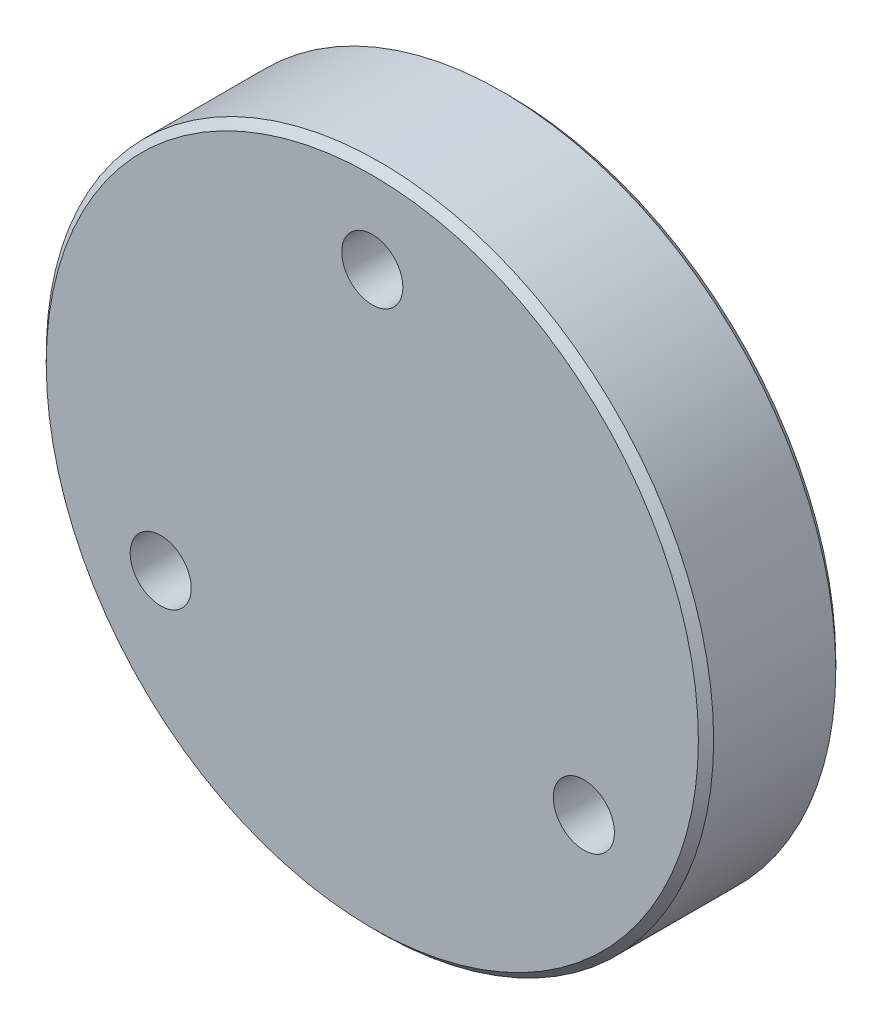
ISO-10303-21;
HEADER;
FILE_DESCRIPTION(('STEP AP214'),'2;1');
FILE_NAME('part.step','',(''),(''),'','','');
FILE_SCHEMA(('AUTOMOTIVE_DESIGN { 1 0 10303 214 1 1 1 1 }'));
ENDSEC;
DATA;
#1=APPLICATION_CONTEXT('core data for automotive mechanical design processes');
#2=APPLICATION_PROTOCOL_DEFINITION('international standard','automotive_design',2000,#1);
#3=PRODUCT_CONTEXT('',#1,'mechanical');
#4=PRODUCT('Part','Part','',(#3));
#5=PRODUCT_RELATED_PRODUCT_CATEGORY('part','',(#4));
#6=PRODUCT_DEFINITION_FORMATION('','',#4);
#7=PRODUCT_DEFINITION_CONTEXT('part definition',#1,'design');
#8=PRODUCT_DEFINITION('design','',#6,#7);
#9=PRODUCT_DEFINITION_SHAPE('','',#8);
#10=(LENGTH_UNIT() NAMED_UNIT(*) SI_UNIT(.MILLI.,.METRE.));
#11=(NAMED_UNIT(*) PLANE_ANGLE_UNIT() SI_UNIT($,.RADIAN.));
#12=(NAMED_UNIT(*) SI_UNIT($,.STERADIAN.) SOLID_ANGLE_UNIT());
#13=UNCERTAINTY_MEASURE_WITH_UNIT(LENGTH_MEASURE(1.E-05),#10,'distance_accuracy_value','');
#14=(GEOMETRIC_REPRESENTATION_CONTEXT(3) GLOBAL_UNCERTAINTY_ASSIGNED_CONTEXT((#13)) GLOBAL_UNIT_ASSIGNED_CONTEXT((#10,
#11,#12)) REPRESENTATION_CONTEXT('',''));
#15=CARTESIAN_POINT('',(0.,0.,0.));
#16=DIRECTION('',(0.,0.,1.));
#17=DIRECTION('',(1.,0.,0.));
#18=AXIS2_PLACEMENT_3D('',#15,#16,#17);
#19=CARTESIAN_POINT('',(0.,0.,14.2875));
#20=DIRECTION('',(0.,0.,-1.));
#21=DIRECTION('',(-1.,0.,0.));
#22=AXIS2_PLACEMENT_3D('',#19,#20,#21);
#23=CYLINDRICAL_SURFACE('',#22,34.6944134078212);
#24=CARTESIAN_POINT('',(0.,-34.6944134078212,3.57187499999998));
#25=CARTESIAN_POINT('',(-0.200065709950713,-34.6944110443672,3.57188364779328));
#26=CARTESIAN_POINT('',(-0.400262921462358,-34.69266450977,3.5887405414694));
#27=CARTESIAN_POINT('',(-0.795104904097458,-34.6858651867832,3.65573028330991));
#28=CARTESIAN_POINT('',(-0.989743348085185,-34.6808087761864,3.7058995882235));
#29=CARTESIAN_POINT('',(-1.36769308672924,-34.6679603571713,3.83803625385658));
#30=CARTESIAN_POINT('',(-1.55101122725323,-34.660170021508,3.91998417400904));
#31=CARTESIAN_POINT('',(-1.90125158680547,-34.6427243502095,4.11331359680572));
#32=CARTESIAN_POINT('',(-2.06817700934844,-34.6330693800653,4.22468933281337));
#33=CARTESIAN_POINT('',(-2.38156773354439,-34.6129345417707,4.47416716212354));
#34=CARTESIAN_POINT('',(-2.52796191455414,-34.6024519937122,4.6123583883865));
#35=CARTESIAN_POINT('',(-2.79552314349917,-34.5818655481583,4.91135415840236));
#36=CARTESIAN_POINT('',(-2.91668901255712,-34.5717616683756,5.07215975829956));
#37=CARTESIAN_POINT('',(-3.13060759837356,-34.5530492956127,5.41226675353249));
#38=CARTESIAN_POINT('',(-3.22329568997945,-34.5444442227752,5.59160900074904));
#39=CARTESIAN_POINT('',(-3.37721499252556,-34.5297372463541,5.96341541971245));
#40=CARTESIAN_POINT('',(-3.43844702447323,-34.5236352774399,6.1558792488357));
#41=CARTESIAN_POINT('',(-3.52750458098557,-34.5146497892999,6.54773855611576));
#42=CARTESIAN_POINT('',(-3.55544832782174,-34.5117548828768,6.74710690047951));
#43=CARTESIAN_POINT('',(-3.57750158119704,-34.5094759995546,7.14772318974449));
#44=CARTESIAN_POINT('',(-3.5716120270518,-34.5100919251841,7.34897108230885));
#45=CARTESIAN_POINT('',(-3.52626325983416,-34.5147547126571,7.74681788414604));
#46=CARTESIAN_POINT('',(-3.48693325039603,-34.5187883692316,7.94343169730891));
#47=CARTESIAN_POINT('',(-3.37602110389757,-34.529811503914,8.32725301255348));
#48=CARTESIAN_POINT('',(-3.30443850768617,-34.5368010241018,8.5144603806819));
#49=CARTESIAN_POINT('',(-3.13091093986535,-34.5529635161083,8.87456209980281));
#50=CARTESIAN_POINT('',(-3.02890877091563,-34.5621405945684,9.04742869644998));
#51=CARTESIAN_POINT('',(-2.79747860493039,-34.5816407384582,9.37363806958224));
#52=CARTESIAN_POINT('',(-2.66804975684523,-34.5919638394441,9.5269802399881));
#53=CARTESIAN_POINT('',(-2.38471920378483,-34.6126517051266,9.81053864629053));
#54=CARTESIAN_POINT('',(-2.23070593823176,-34.6230164390335,9.94064343952025));
#55=CARTESIAN_POINT('',(-1.90296545437887,-34.6425742080327,10.1731697069228));
#56=CARTESIAN_POINT('',(-1.72923821191659,-34.651767241689,10.275591147165));
#57=CARTESIAN_POINT('',(-1.3669231098645,-34.6679490871249,10.4498393536093));
#58=CARTESIAN_POINT('',(-1.17833244331231,-34.674937481305,10.5216603244184));
#59=CARTESIAN_POINT('',(-0.791680920420327,-34.6859184404969,10.6325864605885));
#60=CARTESIAN_POINT('',(-0.593620364515187,-34.6899111004822,10.6716926631068));
#61=CARTESIAN_POINT('',(-0.194616210825272,-34.694438509858,10.715937476107));
#62=CARTESIAN_POINT('',(0.00631016720905355,-34.6949889112239,10.7212298407363));
#63=CARTESIAN_POINT('',(0.406189528983666,-34.6926117884111,10.6981007842273));
#64=CARTESIAN_POINT('',(0.605142540969468,-34.6896843140853,10.6696798463441));
#65=CARTESIAN_POINT('',(0.994982789669328,-34.6806903847393,10.5800585274081));
#66=CARTESIAN_POINT('',(1.18588678192927,-34.6746308381503,10.5189302786798));
#67=CARTESIAN_POINT('',(1.55473111639982,-34.6600524047736,10.3657037655833));
#68=CARTESIAN_POINT('',(1.73267115140902,-34.6515334597303,10.2736047676045));
#69=CARTESIAN_POINT('',(2.07123077672363,-34.6329497787846,10.0606707935239));
#70=CARTESIAN_POINT('',(2.23178663676371,-34.6228796626689,9.93973496507906));
#71=CARTESIAN_POINT('',(2.53037486089912,-34.6023404868262,9.67270465268041));
#72=CARTESIAN_POINT('',(2.66840662496828,-34.5918714164805,9.52660949871274));
#73=CARTESIAN_POINT('',(2.91856354701982,-34.5716670393567,9.21273606581639));
#74=CARTESIAN_POINT('',(3.03058768590625,-34.5619346895812,9.04487705746078));
#75=CARTESIAN_POINT('',(3.22485458791267,-34.5443510509701,8.69263830793547));
#76=CARTESIAN_POINT('',(3.30709777929125,-34.5364997350852,8.50825880438278));
#77=CARTESIAN_POINT('',(3.43929967852738,-34.5235857564001,8.12855717002103));
#78=CARTESIAN_POINT('',(3.48931815523875,-34.5185179335016,7.9332560319209));
#79=CARTESIAN_POINT('',(3.55584456712241,-34.5117288366072,7.53697228773681));
#80=CARTESIAN_POINT('',(3.57235352623975,-34.5100074603546,7.33598985544555));
#81=CARTESIAN_POINT('',(3.57137757781351,-34.5101083957438,6.93505282051145));
#82=CARTESIAN_POINT('',(3.55405135694837,-34.5119141651142,6.73509780853862));
#83=CARTESIAN_POINT('',(3.48622995093089,-34.5188306231274,6.34095546608301));
#84=CARTESIAN_POINT('',(3.43573473149658,-34.523941315186,6.14676814156166));
#85=CARTESIAN_POINT('',(3.30305313206579,-34.5368871260599,5.76967677835391));
#86=CARTESIAN_POINT('',(3.22087173699057,-34.5447218163124,5.58677097008849));
#87=CARTESIAN_POINT('',(3.02716685044931,-34.562233699924,5.23732349888326));
#88=CARTESIAN_POINT('',(2.91564346579349,-34.5719108865759,5.07078177637822));
#89=CARTESIAN_POINT('',(2.66582497631859,-34.5920717691508,4.75797681917923));
#90=CARTESIAN_POINT('',(2.52741157857181,-34.602558900595,4.61180827652558));
#91=CARTESIAN_POINT('',(2.22797831138865,-34.6231267502047,4.34470391101239));
#92=CARTESIAN_POINT('',(2.06695304485436,-34.6332073706009,4.22377412943182));
#93=CARTESIAN_POINT('',(1.72639689697515,-34.6518543899312,4.01032512028235));
#94=CARTESIAN_POINT('',(1.54681809954751,-34.6604167047653,3.91788204143709));
#95=CARTESIAN_POINT('',(1.17471163443001,-34.6750184138567,3.76458653411932));
#96=CARTESIAN_POINT('',(0.982198786656986,-34.68106064028,3.70369862403688));
#97=CARTESIAN_POINT('',(0.657171380798965,-34.6884296835932,3.63036002808357));
#98=CARTESIAN_POINT('',(0.526731805438114,-34.6906630671697,3.60845827202057));
#99=CARTESIAN_POINT('',(0.26421393592816,-34.6936557064992,3.57921293450017));
#100=CARTESIAN_POINT('',(0.132135649050478,-34.694414968791,3.5718692884676));
#101=CARTESIAN_POINT('',(0.,-34.6944134078212,3.57187499999998));
#102=B_SPLINE_CURVE_WITH_KNOTS('',3,(#24,#25,#26,#27,#28,#29,#30,#31,#32,#33,#34,#35,#36,#37,
#38,#39,#40,#41,#42,#43,#44,#45,#46,#47,#48,#49,#50,#51,#52,#53,#54,#55,#56,#57,#58,#59,#60,#61,
#62,#63,#64,#65,#66,#67,#68,#69,#70,#71,#72,#73,#74,#75,#76,#77,#78,#79,#80,#81,#82,#83,#84,#85,
#86,#87,#88,#89,#90,#91,#92,#93,#94,#95,#96,#97,#98,#99,#100,#101),.UNSPECIFIED.,.T.,.F.,(4,2,2,
2,2,2,2,2,2,2,2,2,2,2,2,2,2,2,2,2,2,2,2,2,2,2,2,2,2,2,2,2,2,2,2,2,2,2,4),(0.,0.599714605358392,
1.20008661613602,1.8000919272735,2.39997974923749,3.00189681511426,3.6038420012715,
4.20714327185287,4.81042879538862,5.41156532083811,6.01268515698471,6.61149295016588,
7.21030926830437,7.81025870547282,8.41022676179453,9.01299911995594,9.61577221691371,
10.218659421792,10.8215275125951,11.4216523527038,12.0217685905729,12.6205667614403,
13.2193791171627,13.820317263107,14.4212714150115,15.0245221400423,15.6277641898099,
16.2298841293251,16.8319856696791,17.4312701404845,18.0305552306839,18.6297460788115,
19.2289347458051,19.8308215880257,20.4328523361422,21.036478704595,21.6394248561138,
22.0355148714687,22.4316031298894),.UNSPECIFIED.);
#103=CARTESIAN_POINT('',(0.,-34.6944134078212,3.57187499999998));
#104=VERTEX_POINT('',#103);
#105=EDGE_CURVE('E70',#104,#104,#102,.T.);
#106=ORIENTED_EDGE('',*,*,#105,.T.);
#107=EDGE_LOOP('',(#106));
#108=FACE_BOUND('',#107,.T.);
#109=CARTESIAN_POINT('',(0.,0.,13.49375));
#110=DIRECTION('',(0.,0.,1.));
#111=DIRECTION('',(1.,0.,0.));
#112=AXIS2_PLACEMENT_3D('',#109,#110,#111);
#113=CIRCLE('',#112,34.6944134078212);
#114=CARTESIAN_POINT('',(34.6944134078212,0.,13.49375));
#115=VERTEX_POINT('',#114);
#116=EDGE_CURVE('E147',#115,#115,#113,.F.);
#117=ORIENTED_EDGE('',*,*,#116,.T.);
#118=EDGE_LOOP('',(#117));
#119=FACE_BOUND('',#118,.T.);
#120=CARTESIAN_POINT('',(0.,0.,0.79375000000001));
#121=DIRECTION('',(0.,0.,1.));
#122=DIRECTION('',(1.,0.,0.));
#123=AXIS2_PLACEMENT_3D('',#120,#121,#122);
#124=CIRCLE('',#123,34.6944134078212);
#125=CARTESIAN_POINT('',(34.6944134078212,0.,0.79375000000001));
#126=VERTEX_POINT('',#125);
#127=EDGE_CURVE('E150',#126,#126,#124,.T.);
#128=ORIENTED_EDGE('',*,*,#127,.T.);
#129=EDGE_LOOP('',(#128));
#130=FACE_BOUND('',#129,.T.);
#131=ADVANCED_FACE('F43',(#108,#119,#130),#23,.T.);
#132=CARTESIAN_POINT('',(0.,0.,14.2875));
#133=DIRECTION('',(0.,0.,1.));
#134=DIRECTION('',(1.,0.,0.));
#135=AXIS2_PLACEMENT_3D('',#132,#133,#134);
#136=PLANE('',#135);
#137=CARTESIAN_POINT('',(0.,0.,14.2875));
#138=DIRECTION('',(0.,0.,1.));
#139=DIRECTION('',(1.,0.,0.));
#140=AXIS2_PLACEMENT_3D('',#137,#138,#139);
#141=CIRCLE('',#140,33.9006634078212);
#142=CARTESIAN_POINT('',(33.9006634078212,0.,14.2875));
#143=VERTEX_POINT('',#142);
#144=EDGE_CURVE('E152',#143,#143,#141,.T.);
#145=ORIENTED_EDGE('',*,*,#144,.T.);
#146=EDGE_LOOP('',(#145));
#147=FACE_BOUND('',#146,.T.);
#148=CARTESIAN_POINT('',(0.,25.4,14.2875));
#149=DIRECTION('',(0.,0.,-1.));
#150=DIRECTION('',(-1.,0.,0.));
#151=AXIS2_PLACEMENT_3D('',#148,#149,#150);
#152=CIRCLE('',#151,3.175);
#153=CARTESIAN_POINT('',(-3.175,25.4,14.2875));
#154=VERTEX_POINT('',#153);
#155=EDGE_CURVE('E175',#154,#154,#152,.T.);
#156=ORIENTED_EDGE('',*,*,#155,.T.);
#157=EDGE_LOOP('',(#156));
#158=FACE_BOUND('',#157,.T.);
#159=CARTESIAN_POINT('',(-21.9970452561247,-12.7000000000001,14.2875));
#160=DIRECTION('',(0.,0.,-1.));
#161=DIRECTION('',(-1.,0.,0.));
#162=AXIS2_PLACEMENT_3D('',#159,#160,#161);
#163=CIRCLE('',#162,3.175);
#164=CARTESIAN_POINT('',(-25.1720452561247,-12.7000000000001,14.2875));
#165=VERTEX_POINT('',#164);
#166=EDGE_CURVE('E166',#165,#165,#163,.T.);
#167=ORIENTED_EDGE('',*,*,#166,.T.);
#168=EDGE_LOOP('',(#167));
#169=FACE_BOUND('',#168,.T.);
#170=CARTESIAN_POINT('',(21.9970452561249,-12.6999999999998,14.2875));
#171=DIRECTION('',(0.,0.,-1.));
#172=DIRECTION('',(-1.,0.,0.));
#173=AXIS2_PLACEMENT_3D('',#170,#171,#172);
#174=CIRCLE('',#173,3.175);
#175=CARTESIAN_POINT('',(18.8220452561249,-12.6999999999998,14.2875));
#176=VERTEX_POINT('',#175);
#177=EDGE_CURVE('E155',#176,#176,#174,.T.);
#178=ORIENTED_EDGE('',*,*,#177,.T.);
#179=EDGE_LOOP('',(#178));
#180=FACE_BOUND('',#179,.T.);
#181=ADVANCED_FACE('F128',(#147,#158,#169,#180),#136,.T.);
#182=CARTESIAN_POINT('',(0.,0.,0.));
#183=DIRECTION('',(0.,0.,1.));
#184=DIRECTION('',(1.,0.,0.));
#185=AXIS2_PLACEMENT_3D('',#182,#183,#184);
#186=PLANE('',#185);
#187=CARTESIAN_POINT('',(-21.9970452561247,-12.7000000000001,0.));
#188=DIRECTION('',(0.,0.,1.));
#189=DIRECTION('',(1.,0.,0.));
#190=AXIS2_PLACEMENT_3D('',#187,#188,#189);
#191=CIRCLE('',#190,6.746875);
#192=CARTESIAN_POINT('',(-15.2501702561247,-12.7000000000001,0.));
#193=VERTEX_POINT('',#192);
#194=EDGE_CURVE('E55',#193,#193,#191,.T.);
#195=ORIENTED_EDGE('',*,*,#194,.T.);
#196=EDGE_LOOP('',(#195));
#197=FACE_BOUND('',#196,.T.);
#198=CARTESIAN_POINT('',(21.9970452561249,-12.6999999999998,0.));
#199=DIRECTION('',(0.,0.,1.));
#200=DIRECTION('',(1.,0.,0.));
#201=AXIS2_PLACEMENT_3D('',#198,#199,#200);
#202=CIRCLE('',#201,6.746875);
#203=CARTESIAN_POINT('',(28.7439202561249,-12.6999999999998,0.));
#204=VERTEX_POINT('',#203);
#205=EDGE_CURVE('E59',#204,#204,#202,.T.);
#206=ORIENTED_EDGE('',*,*,#205,.T.);
#207=EDGE_LOOP('',(#206));
#208=FACE_BOUND('',#207,.T.);
#209=CARTESIAN_POINT('',(0.,25.4,0.));
#210=DIRECTION('',(0.,0.,1.));
#211=DIRECTION('',(1.,0.,0.));
#212=AXIS2_PLACEMENT_3D('',#209,#210,#211);
#213=CIRCLE('',#212,6.746875);
#214=CARTESIAN_POINT('',(6.746875,25.4,0.));
#215=VERTEX_POINT('',#214);
#216=EDGE_CURVE('E64',#215,#215,#213,.T.);
#217=ORIENTED_EDGE('',*,*,#216,.T.);
#218=EDGE_LOOP('',(#217));
#219=FACE_BOUND('',#218,.T.);
#220=CARTESIAN_POINT('',(0.,0.,0.));
#221=DIRECTION('',(0.,0.,1.));
#222=DIRECTION('',(1.,0.,0.));
#223=AXIS2_PLACEMENT_3D('',#220,#221,#222);
#224=CIRCLE('',#223,33.9006634078212);
#225=CARTESIAN_POINT('',(33.9006634078212,0.,0.));
#226=VERTEX_POINT('',#225);
#227=EDGE_CURVE('E78',#226,#226,#224,.F.);
#228=ORIENTED_EDGE('',*,*,#227,.T.);
#229=EDGE_LOOP('',(#228));
#230=FACE_BOUND('',#229,.T.);
#231=ADVANCED_FACE('F126',(#197,#208,#219,#230),#186,.F.);
#232=CARTESIAN_POINT('',(21.9970452561249,-12.6999999999998,0.));
#233=DIRECTION('',(0.,0.,-1.));
#234=DIRECTION('',(-1.,0.,0.));
#235=AXIS2_PLACEMENT_3D('',#232,#233,#234);
#236=CYLINDRICAL_SURFACE('',#235,3.175);
#237=ORIENTED_EDGE('',*,*,#177,.F.);
#238=EDGE_LOOP('',(#237));
#239=FACE_BOUND('',#238,.T.);
#240=CARTESIAN_POINT('',(21.9970452561249,-12.6999999999998,5.08));
#241=DIRECTION('',(0.,0.,-1.));
#242=DIRECTION('',(-1.,0.,0.));
#243=AXIS2_PLACEMENT_3D('',#240,#241,#242);
#244=CIRCLE('',#243,3.175);
#245=CARTESIAN_POINT('',(18.8220452561249,-12.6999999999998,5.08));
#246=VERTEX_POINT('',#245);
#247=EDGE_CURVE('E160',#246,#246,#244,.T.);
#248=ORIENTED_EDGE('',*,*,#247,.T.);
#249=EDGE_LOOP('',(#248));
#250=FACE_BOUND('',#249,.T.);
#251=ADVANCED_FACE('F122',(#239,#250),#236,.F.);
#252=CARTESIAN_POINT('',(25.1720452561249,-12.6999999999998,5.08));
#253=DIRECTION('',(0.,0.,1.));
#254=DIRECTION('',(1.,0.,0.));
#255=AXIS2_PLACEMENT_3D('',#252,#253,#254);
#256=PLANE('',#255);
#257=ORIENTED_EDGE('',*,*,#247,.F.);
#258=EDGE_LOOP('',(#257));
#259=FACE_BOUND('',#258,.T.);
#260=CARTESIAN_POINT('',(21.9970452561249,-12.6999999999998,5.08));
#261=DIRECTION('',(0.,0.,-1.));
#262=DIRECTION('',(-1.,0.,0.));
#263=AXIS2_PLACEMENT_3D('',#260,#261,#262);
#264=CIRCLE('',#263,6.35);
#265=CARTESIAN_POINT('',(15.6470452561249,-12.6999999999998,5.08));
#266=VERTEX_POINT('',#265);
#267=EDGE_CURVE('E163',#266,#266,#264,.T.);
#268=ORIENTED_EDGE('',*,*,#267,.T.);
#269=EDGE_LOOP('',(#268));
#270=FACE_BOUND('',#269,.T.);
#271=ADVANCED_FACE('F119',(#259,#270),#256,.F.);
#272=CARTESIAN_POINT('',(21.9970452561249,-12.6999999999998,0.));
#273=DIRECTION('',(0.,0.,-1.));
#274=DIRECTION('',(-1.,0.,0.));
#275=AXIS2_PLACEMENT_3D('',#272,#273,#274);
#276=CYLINDRICAL_SURFACE('',#275,6.35);
#277=CARTESIAN_POINT('',(21.9970452561249,-12.6999999999998,0.396875000000006));
#278=DIRECTION('',(0.,0.,1.));
#279=DIRECTION('',(1.,0.,0.));
#280=AXIS2_PLACEMENT_3D('',#277,#278,#279);
#281=CIRCLE('',#280,6.35);
#282=CARTESIAN_POINT('',(28.3470452561249,-12.6999999999998,0.396875000000006));
#283=VERTEX_POINT('',#282);
#284=EDGE_CURVE('E51',#283,#283,#281,.F.);
#285=ORIENTED_EDGE('',*,*,#284,.T.);
#286=EDGE_LOOP('',(#285));
#287=FACE_BOUND('',#286,.T.);
#288=ORIENTED_EDGE('',*,*,#267,.F.);
#289=EDGE_LOOP('',(#288));
#290=FACE_BOUND('',#289,.T.);
#291=ADVANCED_FACE('F115',(#287,#290),#276,.F.);
#292=CARTESIAN_POINT('',(-21.9970452561247,-12.7000000000001,0.));
#293=DIRECTION('',(0.,0.,-1.));
#294=DIRECTION('',(-1.,0.,0.));
#295=AXIS2_PLACEMENT_3D('',#292,#293,#294);
#296=CYLINDRICAL_SURFACE('',#295,3.175);
#297=ORIENTED_EDGE('',*,*,#166,.F.);
#298=EDGE_LOOP('',(#297));
#299=FACE_BOUND('',#298,.T.);
#300=CARTESIAN_POINT('',(-21.9970452561247,-12.7000000000001,5.08));
#301=DIRECTION('',(0.,0.,-1.));
#302=DIRECTION('',(-1.,0.,0.));
#303=AXIS2_PLACEMENT_3D('',#300,#301,#302);
#304=CIRCLE('',#303,3.175);
#305=CARTESIAN_POINT('',(-25.1720452561247,-12.7000000000001,5.08));
#306=VERTEX_POINT('',#305);
#307=EDGE_CURVE('E169',#306,#306,#304,.T.);
#308=ORIENTED_EDGE('',*,*,#307,.T.);
#309=EDGE_LOOP('',(#308));
#310=FACE_BOUND('',#309,.T.);
#311=ADVANCED_FACE('F111',(#299,#310),#296,.F.);
#312=CARTESIAN_POINT('',(-18.8220452561247,-12.7000000000001,5.08));
#313=DIRECTION('',(0.,0.,1.));
#314=DIRECTION('',(1.,0.,0.));
#315=AXIS2_PLACEMENT_3D('',#312,#313,#314);
#316=PLANE('',#315);
#317=ORIENTED_EDGE('',*,*,#307,.F.);
#318=EDGE_LOOP('',(#317));
#319=FACE_BOUND('',#318,.T.);
#320=CARTESIAN_POINT('',(-21.9970452561247,-12.7000000000001,5.08));
#321=DIRECTION('',(0.,0.,-1.));
#322=DIRECTION('',(-1.,0.,0.));
#323=AXIS2_PLACEMENT_3D('',#320,#321,#322);
#324=CIRCLE('',#323,6.35);
#325=CARTESIAN_POINT('',(-28.3470452561247,-12.7000000000001,5.08));
#326=VERTEX_POINT('',#325);
#327=EDGE_CURVE('E172',#326,#326,#324,.T.);
#328=ORIENTED_EDGE('',*,*,#327,.T.);
#329=EDGE_LOOP('',(#328));
#330=FACE_BOUND('',#329,.T.);
#331=ADVANCED_FACE('F107',(#319,#330),#316,.F.);
#332=CARTESIAN_POINT('',(-21.9970452561247,-12.7000000000001,0.));
#333=DIRECTION('',(0.,0.,-1.));
#334=DIRECTION('',(-1.,0.,0.));
#335=AXIS2_PLACEMENT_3D('',#332,#333,#334);
#336=CYLINDRICAL_SURFACE('',#335,6.35);
#337=CARTESIAN_POINT('',(-21.9970452561247,-12.7000000000001,0.396875000000008));
#338=DIRECTION('',(0.,0.,1.));
#339=DIRECTION('',(1.,0.,0.));
#340=AXIS2_PLACEMENT_3D('',#337,#338,#339);
#341=CIRCLE('',#340,6.35);
#342=CARTESIAN_POINT('',(-15.6470452561247,-12.7000000000001,0.396875000000008));
#343=VERTEX_POINT('',#342);
#344=EDGE_CURVE('E67',#343,#343,#341,.F.);
#345=ORIENTED_EDGE('',*,*,#344,.T.);
#346=EDGE_LOOP('',(#345));
#347=FACE_BOUND('',#346,.T.);
#348=ORIENTED_EDGE('',*,*,#327,.F.);
#349=EDGE_LOOP('',(#348));
#350=FACE_BOUND('',#349,.T.);
#351=ADVANCED_FACE('F103',(#347,#350),#336,.F.);
#352=CARTESIAN_POINT('',(0.,25.4,0.));
#353=DIRECTION('',(0.,0.,-1.));
#354=DIRECTION('',(-1.,0.,0.));
#355=AXIS2_PLACEMENT_3D('',#352,#353,#354);
#356=CYLINDRICAL_SURFACE('',#355,3.175);
#357=ORIENTED_EDGE('',*,*,#155,.F.);
#358=EDGE_LOOP('',(#357));
#359=FACE_BOUND('',#358,.T.);
#360=CARTESIAN_POINT('',(0.,25.4,5.08));
#361=DIRECTION('',(0.,0.,-1.));
#362=DIRECTION('',(-1.,0.,0.));
#363=AXIS2_PLACEMENT_3D('',#360,#361,#362);
#364=CIRCLE('',#363,3.175);
#365=CARTESIAN_POINT('',(-3.175,25.4,5.08));
#366=VERTEX_POINT('',#365);
#367=EDGE_CURVE('E178',#366,#366,#364,.T.);
#368=ORIENTED_EDGE('',*,*,#367,.T.);
#369=EDGE_LOOP('',(#368));
#370=FACE_BOUND('',#369,.T.);
#371=ADVANCED_FACE('F99',(#359,#370),#356,.F.);
#372=CARTESIAN_POINT('',(3.175,25.4,5.08));
#373=DIRECTION('',(0.,0.,1.));
#374=DIRECTION('',(1.,0.,0.));
#375=AXIS2_PLACEMENT_3D('',#372,#373,#374);
#376=PLANE('',#375);
#377=ORIENTED_EDGE('',*,*,#367,.F.);
#378=EDGE_LOOP('',(#377));
#379=FACE_BOUND('',#378,.T.);
#380=CARTESIAN_POINT('',(0.,25.4,5.08));
#381=DIRECTION('',(0.,0.,-1.));
#382=DIRECTION('',(-1.,0.,0.));
#383=AXIS2_PLACEMENT_3D('',#380,#381,#382);
#384=CIRCLE('',#383,6.35);
#385=CARTESIAN_POINT('',(-6.35,25.4,5.08));
#386=VERTEX_POINT('',#385);
#387=EDGE_CURVE('E181',#386,#386,#384,.T.);
#388=ORIENTED_EDGE('',*,*,#387,.T.);
#389=EDGE_LOOP('',(#388));
#390=FACE_BOUND('',#389,.T.);
#391=ADVANCED_FACE('F96',(#379,#390),#376,.F.);
#392=CARTESIAN_POINT('',(0.,25.4,0.));
#393=DIRECTION('',(0.,0.,-1.));
#394=DIRECTION('',(-1.,0.,0.));
#395=AXIS2_PLACEMENT_3D('',#392,#393,#394);
#396=CYLINDRICAL_SURFACE('',#395,6.35);
#397=CARTESIAN_POINT('',(0.,25.4,0.396875000000006));
#398=DIRECTION('',(0.,0.,1.));
#399=DIRECTION('',(1.,0.,0.));
#400=AXIS2_PLACEMENT_3D('',#397,#398,#399);
#401=CIRCLE('',#400,6.35);
#402=CARTESIAN_POINT('',(6.35,25.4,0.396875000000006));
#403=VERTEX_POINT('',#402);
#404=EDGE_CURVE('E10',#403,#403,#401,.F.);
#405=ORIENTED_EDGE('',*,*,#404,.T.);
#406=EDGE_LOOP('',(#405));
#407=FACE_BOUND('',#406,.T.);
#408=ORIENTED_EDGE('',*,*,#387,.F.);
#409=EDGE_LOOP('',(#408));
#410=FACE_BOUND('',#409,.T.);
#411=ADVANCED_FACE('F92',(#407,#410),#396,.F.);
#412=CARTESIAN_POINT('',(0.,0.,14.2875));
#413=DIRECTION('',(0.,0.,-1.));
#414=DIRECTION('',(-1.,0.,0.));
#415=AXIS2_PLACEMENT_3D('',#412,#413,#414);
#416=CONICAL_SURFACE('',#415,33.9006634078212,0.785398163397453);
#417=ORIENTED_EDGE('',*,*,#116,.F.);
#418=EDGE_LOOP('',(#417));
#419=FACE_BOUND('',#418,.T.);
#420=ORIENTED_EDGE('',*,*,#144,.F.);
#421=EDGE_LOOP('',(#420));
#422=FACE_BOUND('',#421,.T.);
#423=ADVANCED_FACE('F95',(#419,#422),#416,.T.);
#424=CARTESIAN_POINT('',(0.,0.,0.79375000000001));
#425=DIRECTION('',(0.,0.,1.));
#426=DIRECTION('',(1.,0.,0.));
#427=AXIS2_PLACEMENT_3D('',#424,#425,#426);
#428=CONICAL_SURFACE('',#427,34.6944134078212,0.785398163397444);
#429=ORIENTED_EDGE('',*,*,#227,.F.);
#430=EDGE_LOOP('',(#429));
#431=FACE_BOUND('',#430,.T.);
#432=ORIENTED_EDGE('',*,*,#127,.F.);
#433=EDGE_LOOP('',(#432));
#434=FACE_BOUND('',#433,.T.);
#435=ADVANCED_FACE('F89',(#431,#434),#428,.T.);
#436=CARTESIAN_POINT('',(0.,-28.3444134078212,7.14374999999999));
#437=DIRECTION('',(0.,-1.,0.));
#438=DIRECTION('',(0.,0.,-1.));
#439=AXIS2_PLACEMENT_3D('',#436,#437,#438);
#440=CYLINDRICAL_SURFACE('',#439,3.57187500000001);
#441=CARTESIAN_POINT('',(0.,-28.3444134078212,7.14374999999999));
#442=DIRECTION('',(0.,-1.,0.));
#443=DIRECTION('',(0.,0.,-1.));
#444=AXIS2_PLACEMENT_3D('',#441,#442,#443);
#445=CIRCLE('',#444,3.57187500000001);
#446=CARTESIAN_POINT('',(0.,-28.3444134078212,3.57187499999998));
#447=VERTEX_POINT('',#446);
#448=EDGE_CURVE('E184',#447,#447,#445,.T.);
#449=ORIENTED_EDGE('',*,*,#448,.F.);
#450=EDGE_LOOP('',(#449));
#451=FACE_BOUND('',#450,.T.);
#452=ORIENTED_EDGE('',*,*,#105,.F.);
#453=EDGE_LOOP('',(#452));
#454=FACE_BOUND('',#453,.T.);
#455=ADVANCED_FACE('F83',(#451,#454),#440,.F.);
#456=CARTESIAN_POINT('',(0.,-28.3444134078212,7.14374999999999));
#457=DIRECTION('',(0.,-1.,0.));
#458=DIRECTION('',(0.,0.,-1.));
#459=AXIS2_PLACEMENT_3D('',#456,#457,#458);
#460=PLANE('',#459);
#461=CARTESIAN_POINT('',(0.,-28.3444134078212,7.14374999999999));
#462=DIRECTION('',(0.,-1.,0.));
#463=DIRECTION('',(0.,0.,-1.));
#464=AXIS2_PLACEMENT_3D('',#461,#462,#463);
#465=CIRCLE('',#464,2.75803983571628);
#466=CARTESIAN_POINT('',(0.,-28.3444134078212,4.38571016428371));
#467=VERTEX_POINT('',#466);
#468=EDGE_CURVE('E188',#467,#467,#465,.T.);
#469=ORIENTED_EDGE('',*,*,#468,.F.);
#470=EDGE_LOOP('',(#469));
#471=FACE_BOUND('',#470,.T.);
#472=ORIENTED_EDGE('',*,*,#448,.T.);
#473=EDGE_LOOP('',(#472));
#474=FACE_BOUND('',#473,.T.);
#475=ADVANCED_FACE('F88',(#471,#474),#460,.T.);
#476=CARTESIAN_POINT('',(0.,-2.94441340782123,7.14374999999999));
#477=DIRECTION('',(0.,-1.,0.));
#478=DIRECTION('',(0.,0.,-1.));
#479=AXIS2_PLACEMENT_3D('',#476,#477,#478);
#480=CYLINDRICAL_SURFACE('',#479,2.75803983571628);
#481=CARTESIAN_POINT('',(0.,-2.94441340782123,7.14374999999999));
#482=DIRECTION('',(0.,-1.,0.));
#483=DIRECTION('',(0.,0.,-1.));
#484=AXIS2_PLACEMENT_3D('',#481,#482,#483);
#485=CIRCLE('',#484,2.75803983571628);
#486=CARTESIAN_POINT('',(0.,-2.94441340782123,4.38571016428371));
#487=VERTEX_POINT('',#486);
#488=EDGE_CURVE('E187',#487,#487,#485,.T.);
#489=ORIENTED_EDGE('',*,*,#488,.F.);
#490=EDGE_LOOP('',(#489));
#491=FACE_BOUND('',#490,.T.);
#492=ORIENTED_EDGE('',*,*,#468,.T.);
#493=EDGE_LOOP('',(#492));
#494=FACE_BOUND('',#493,.T.);
#495=ADVANCED_FACE('F196',(#491,#494),#480,.F.);
#496=CARTESIAN_POINT('',(0.,-2.94441340782123,7.14374999999999));
#497=DIRECTION('',(0.,-1.,0.));
#498=DIRECTION('',(0.,0.,-1.));
#499=AXIS2_PLACEMENT_3D('',#496,#497,#498);
#500=PLANE('',#499);
#501=ORIENTED_EDGE('',*,*,#488,.T.);
#502=EDGE_LOOP('',(#501));
#503=FACE_BOUND('',#502,.T.);
#504=ADVANCED_FACE('F194',(#503),#500,.T.);
#505=CARTESIAN_POINT('',(-21.9970452561247,-12.7000000000001,0.396875000000008));
#506=DIRECTION('',(0.,0.,-1.));
#507=DIRECTION('',(-1.,0.,0.));
#508=AXIS2_PLACEMENT_3D('',#505,#506,#507);
#509=CONICAL_SURFACE('',#508,6.35,0.78539816339744);
#510=ORIENTED_EDGE('',*,*,#194,.F.);
#511=EDGE_LOOP('',(#510));
#512=FACE_BOUND('',#511,.T.);
#513=ORIENTED_EDGE('',*,*,#344,.F.);
#514=EDGE_LOOP('',(#513));
#515=FACE_BOUND('',#514,.T.);
#516=ADVANCED_FACE('F219',(#512,#515),#509,.F.);
#517=CARTESIAN_POINT('',(21.9970452561249,-12.6999999999998,0.396875000000006));
#518=DIRECTION('',(0.,0.,-1.));
#519=DIRECTION('',(-1.,0.,0.));
#520=AXIS2_PLACEMENT_3D('',#517,#518,#519);
#521=CONICAL_SURFACE('',#520,6.35,0.785398163397439);
#522=ORIENTED_EDGE('',*,*,#205,.F.);
#523=EDGE_LOOP('',(#522));
#524=FACE_BOUND('',#523,.T.);
#525=ORIENTED_EDGE('',*,*,#284,.F.);
#526=EDGE_LOOP('',(#525));
#527=FACE_BOUND('',#526,.T.);
#528=ADVANCED_FACE('F231',(#524,#527),#521,.F.);
#529=CARTESIAN_POINT('',(0.,25.4,0.396875000000006));
#530=DIRECTION('',(0.,0.,-1.));
#531=DIRECTION('',(-1.,0.,0.));
#532=AXIS2_PLACEMENT_3D('',#529,#530,#531);
#533=CONICAL_SURFACE('',#532,6.35,0.785398163397439);
#534=ORIENTED_EDGE('',*,*,#216,.F.);
#535=EDGE_LOOP('',(#534));
#536=FACE_BOUND('',#535,.T.);
#537=ORIENTED_EDGE('',*,*,#404,.F.);
#538=EDGE_LOOP('',(#537));
#539=FACE_BOUND('',#538,.T.);
#540=ADVANCED_FACE('F46',(#536,#539),#533,.F.);
#541=CLOSED_SHELL('',(#131,#181,#231,#251,#271,#291,#311,#331,#351,#371,#391,#411,#423,#435,
#455,#475,#495,#504,#516,#528,#540));
#542=MANIFOLD_SOLID_BREP('B2',#541);
#543=ADVANCED_BREP_SHAPE_REPRESENTATION('',(#18,#542),#14);
#544=SHAPE_DEFINITION_REPRESENTATION(#9,#543);
ENDSEC;
END-ISO-10303-21;
